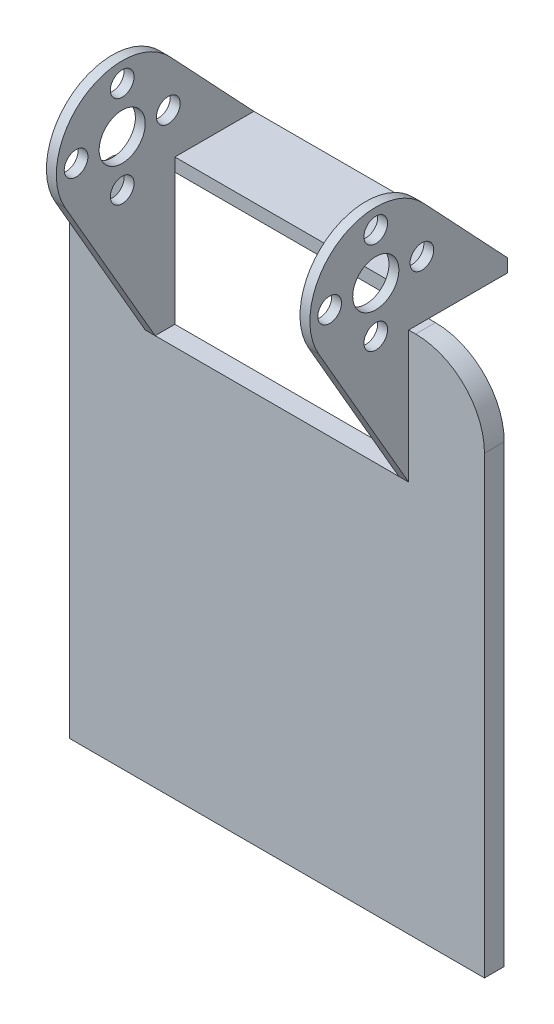
ISO-10303-21;
HEADER;
FILE_DESCRIPTION(('STEP AP214'),'2;1');
FILE_NAME('part.step','',(''),(''),'','','');
FILE_SCHEMA(('AUTOMOTIVE_DESIGN { 1 0 10303 214 1 1 1 1 }'));
ENDSEC;
DATA;
#1=APPLICATION_CONTEXT('core data for automotive mechanical design processes');
#2=APPLICATION_PROTOCOL_DEFINITION('international standard','automotive_design',2000,#1);
#3=PRODUCT_CONTEXT('',#1,'mechanical');
#4=PRODUCT('Part','Part','',(#3));
#5=PRODUCT_RELATED_PRODUCT_CATEGORY('part','',(#4));
#6=PRODUCT_DEFINITION_FORMATION('','',#4);
#7=PRODUCT_DEFINITION_CONTEXT('part definition',#1,'design');
#8=PRODUCT_DEFINITION('design','',#6,#7);
#9=PRODUCT_DEFINITION_SHAPE('','',#8);
#10=(LENGTH_UNIT() NAMED_UNIT(*) SI_UNIT(.MILLI.,.METRE.));
#11=(NAMED_UNIT(*) PLANE_ANGLE_UNIT() SI_UNIT($,.RADIAN.));
#12=(NAMED_UNIT(*) SI_UNIT($,.STERADIAN.) SOLID_ANGLE_UNIT());
#13=UNCERTAINTY_MEASURE_WITH_UNIT(LENGTH_MEASURE(1.E-05),#10,'distance_accuracy_value','');
#14=(GEOMETRIC_REPRESENTATION_CONTEXT(3) GLOBAL_UNCERTAINTY_ASSIGNED_CONTEXT((#13)) GLOBAL_UNIT_ASSIGNED_CONTEXT((#10,
#11,#12)) REPRESENTATION_CONTEXT('',''));
#15=CARTESIAN_POINT('',(0.,0.,0.));
#16=DIRECTION('',(0.,0.,1.));
#17=DIRECTION('',(1.,0.,0.));
#18=AXIS2_PLACEMENT_3D('',#15,#16,#17);
#19=CARTESIAN_POINT('',(51.5,88.1102540378444,8.));
#20=DIRECTION('',(-1.,0.,0.));
#21=DIRECTION('',(0.,-1.,0.));
#22=AXIS2_PLACEMENT_3D('',#19,#20,#21);
#23=CYLINDRICAL_SURFACE('',#22,10.);
#24=DIRECTION('',(-1.,0.,0.));
#25=VECTOR('',#24,1.);
#26=CARTESIAN_POINT('',(51.5,94.9636250995552,0.717740385669768));
#27=LINE('',#26,#25);
#28=CARTESIAN_POINT('',(51.5,94.9636250995552,0.717740385669768));
#29=VERTEX_POINT('',#28);
#30=CARTESIAN_POINT('',(50.,94.9636250995552,0.717740385669768));
#31=VERTEX_POINT('',#30);
#32=EDGE_CURVE('E193',#29,#31,#27,.T.);
#33=ORIENTED_EDGE('',*,*,#32,.T.);
#34=CARTESIAN_POINT('',(50.,88.1102540378444,8.));
#35=DIRECTION('',(-1.,0.,0.));
#36=DIRECTION('',(0.,-1.,0.));
#37=AXIS2_PLACEMENT_3D('',#34,#35,#36);
#38=CIRCLE('',#37,10.);
#39=CARTESIAN_POINT('',(50.,83.1102540378444,16.6602540378444));
#40=VERTEX_POINT('',#39);
#41=EDGE_CURVE('E62',#40,#31,#38,.T.);
#42=ORIENTED_EDGE('',*,*,#41,.F.);
#43=DIRECTION('',(-1.,0.,0.));
#44=VECTOR('',#43,1.);
#45=CARTESIAN_POINT('',(51.5,83.1102540378444,16.6602540378444));
#46=LINE('',#45,#44);
#47=CARTESIAN_POINT('',(51.5,83.1102540378444,16.6602540378444));
#48=VERTEX_POINT('',#47);
#49=EDGE_CURVE('E190',#48,#40,#46,.T.);
#50=ORIENTED_EDGE('',*,*,#49,.F.);
#51=CARTESIAN_POINT('',(51.5,88.1102540378444,8.));
#52=DIRECTION('',(-1.,0.,0.));
#53=DIRECTION('',(0.,-1.,0.));
#54=AXIS2_PLACEMENT_3D('',#51,#52,#53);
#55=CIRCLE('',#54,10.);
#56=EDGE_CURVE('E349',#48,#29,#55,.T.);
#57=ORIENTED_EDGE('',*,*,#56,.T.);
#58=EDGE_LOOP('',(#33,#42,#50,#57));
#59=FACE_BOUND('',#58,.T.);
#60=ADVANCED_FACE('F37',(#59),#23,.T.);
#61=CARTESIAN_POINT('',(51.5,13.5634618943234,-23.4926051274925));
#62=DIRECTION('',(0.,0.500000000000001,-0.866025403784438));
#63=DIRECTION('',(0.,0.866025403784438,0.500000000000001));
#64=AXIS2_PLACEMENT_3D('',#61,#62,#63);
#65=PLANE('',#64);
#66=DIRECTION('',(0.,0.866025403784438,0.500000000000001));
#67=VECTOR('',#66,1.);
#68=CARTESIAN_POINT('',(50.,13.5634618943234,-23.4926051274925));
#69=LINE('',#68,#67);
#70=CARTESIAN_POINT('',(50.,59.4500000000001,3.));
#71=VERTEX_POINT('',#70);
#72=EDGE_CURVE('E177',#71,#40,#69,.T.);
#73=ORIENTED_EDGE('',*,*,#72,.F.);
#74=DIRECTION('',(-1.,0.,0.));
#75=VECTOR('',#74,1.);
#76=CARTESIAN_POINT('',(51.5,59.4500000000001,3.));
#77=LINE('',#76,#75);
#78=CARTESIAN_POINT('',(51.5,59.4500000000001,3.));
#79=VERTEX_POINT('',#78);
#80=EDGE_CURVE('E205',#79,#71,#77,.T.);
#81=ORIENTED_EDGE('',*,*,#80,.F.);
#82=DIRECTION('',(0.,-0.866025403784438,-0.500000000000001));
#83=VECTOR('',#82,1.);
#84=CARTESIAN_POINT('',(51.5,13.5634618943234,-23.4926051274925));
#85=LINE('',#84,#83);
#86=EDGE_CURVE('E197',#48,#79,#85,.T.);
#87=ORIENTED_EDGE('',*,*,#86,.F.);
#88=ORIENTED_EDGE('',*,*,#49,.T.);
#89=EDGE_LOOP('',(#73,#81,#87,#88));
#90=FACE_BOUND('',#89,.T.);
#91=ADVANCED_FACE('F196',(#90),#65,.F.);
#92=CARTESIAN_POINT('',(51.5,44.2449652803494,-47.0138448505518));
#93=DIRECTION('',(0.,-0.685337106171078,0.728225961433024));
#94=DIRECTION('',(0.,-0.728225961433024,-0.685337106171078));
#95=AXIS2_PLACEMENT_3D('',#92,#93,#94);
#96=PLANE('',#95);
#97=DIRECTION('',(0.,-0.728225961433025,-0.685337106171078));
#98=VECTOR('',#97,1.);
#99=CARTESIAN_POINT('',(50.,44.2449652803494,-47.0138448505518));
#100=LINE('',#99,#98);
#101=CARTESIAN_POINT('',(50.,81.45,-12.));
#102=VERTEX_POINT('',#101);
#103=EDGE_CURVE('E194',#31,#102,#100,.T.);
#104=ORIENTED_EDGE('',*,*,#103,.F.);
#105=ORIENTED_EDGE('',*,*,#32,.F.);
#106=DIRECTION('',(0.,0.728225961433024,0.685337106171078));
#107=VECTOR('',#106,1.);
#108=CARTESIAN_POINT('',(51.5,44.2449652803494,-47.0138448505518));
#109=LINE('',#108,#107);
#110=CARTESIAN_POINT('',(51.5,81.45,-12.));
#111=VERTEX_POINT('',#110);
#112=EDGE_CURVE('E351',#111,#29,#109,.T.);
#113=ORIENTED_EDGE('',*,*,#112,.F.);
#114=DIRECTION('',(1.,0.,0.));
#115=VECTOR('',#114,1.);
#116=CARTESIAN_POINT('',(51.5,81.45,-12.));
#117=LINE('',#116,#115);
#118=EDGE_CURVE('E217',#102,#111,#117,.T.);
#119=ORIENTED_EDGE('',*,*,#118,.F.);
#120=EDGE_LOOP('',(#104,#105,#113,#119));
#121=FACE_BOUND('',#120,.T.);
#122=ADVANCED_FACE('F409',(#121),#96,.F.);
#123=CARTESIAN_POINT('',(10.45,69.,3.));
#124=DIRECTION('',(0.,0.,-1.));
#125=DIRECTION('',(-1.,0.,0.));
#126=AXIS2_PLACEMENT_3D('',#123,#124,#125);
#127=PLANE('',#126);
#128=DIRECTION('',(0.,-1.,0.));
#129=VECTOR('',#128,1.);
#130=CARTESIAN_POINT('',(51.5,0.,3.));
#131=LINE('',#130,#129);
#132=CARTESIAN_POINT('',(51.5,79.45,3.));
#133=VERTEX_POINT('',#132);
#134=EDGE_CURVE('E352',#133,#79,#131,.T.);
#135=ORIENTED_EDGE('',*,*,#134,.T.);
#136=ORIENTED_EDGE('',*,*,#80,.T.);
#137=DIRECTION('',(1.,0.,0.));
#138=VECTOR('',#137,1.);
#139=CARTESIAN_POINT('',(13.,59.4500000000001,3.));
#140=LINE('',#139,#138);
#141=CARTESIAN_POINT('',(13.,59.4500000000001,3.));
#142=VERTEX_POINT('',#141);
#143=EDGE_CURVE('E327',#142,#71,#140,.T.);
#144=ORIENTED_EDGE('',*,*,#143,.F.);
#145=CARTESIAN_POINT('',(11.5,59.4500000000001,3.));
#146=VERTEX_POINT('',#145);
#147=EDGE_CURVE('E210',#142,#146,#77,.T.);
#148=ORIENTED_EDGE('',*,*,#147,.T.);
#149=DIRECTION('',(0.,-1.,0.));
#150=VECTOR('',#149,1.);
#151=CARTESIAN_POINT('',(11.5,0.,3.));
#152=LINE('',#151,#150);
#153=CARTESIAN_POINT('',(11.5,79.45,3.));
#154=VERTEX_POINT('',#153);
#155=EDGE_CURVE('E343',#154,#146,#152,.T.);
#156=ORIENTED_EDGE('',*,*,#155,.F.);
#157=DIRECTION('',(-1.,0.,0.));
#158=VECTOR('',#157,1.);
#159=CARTESIAN_POINT('',(10.45,79.45,3.));
#160=LINE('',#159,#158);
#161=CARTESIAN_POINT('',(10.45,79.45,3.));
#162=VERTEX_POINT('',#161);
#163=EDGE_CURVE('E240',#154,#162,#160,.T.);
#164=ORIENTED_EDGE('',*,*,#163,.T.);
#165=CARTESIAN_POINT('',(10.45,69.,3.));
#166=DIRECTION('',(0.,0.,1.));
#167=DIRECTION('',(-1.,0.,0.));
#168=AXIS2_PLACEMENT_3D('',#165,#166,#167);
#169=CIRCLE('',#168,10.45);
#170=CARTESIAN_POINT('',(0.,69.,3.));
#171=VERTEX_POINT('',#170);
#172=EDGE_CURVE('E244',#162,#171,#169,.T.);
#173=ORIENTED_EDGE('',*,*,#172,.T.);
#174=DIRECTION('',(0.,-1.,0.));
#175=VECTOR('',#174,1.);
#176=CARTESIAN_POINT('',(0.,0.,3.));
#177=LINE('',#176,#175);
#178=CARTESIAN_POINT('',(0.,0.,3.));
#179=VERTEX_POINT('',#178);
#180=EDGE_CURVE('E230',#171,#179,#177,.T.);
#181=ORIENTED_EDGE('',*,*,#180,.T.);
#182=DIRECTION('',(1.,0.,0.));
#183=VECTOR('',#182,1.);
#184=CARTESIAN_POINT('',(0.,0.,3.));
#185=LINE('',#184,#183);
#186=CARTESIAN_POINT('',(63.,0.,3.));
#187=VERTEX_POINT('',#186);
#188=EDGE_CURVE('E233',#179,#187,#185,.T.);
#189=ORIENTED_EDGE('',*,*,#188,.T.);
#190=DIRECTION('',(0.,1.,0.));
#191=VECTOR('',#190,1.);
#192=CARTESIAN_POINT('',(63.,0.,3.));
#193=LINE('',#192,#191);
#194=CARTESIAN_POINT('',(63.,69.,3.));
#195=VERTEX_POINT('',#194);
#196=EDGE_CURVE('E236',#187,#195,#193,.T.);
#197=ORIENTED_EDGE('',*,*,#196,.T.);
#198=CARTESIAN_POINT('',(52.55,69.,3.));
#199=DIRECTION('',(0.,0.,1.));
#200=DIRECTION('',(1.,0.,0.));
#201=AXIS2_PLACEMENT_3D('',#198,#199,#200);
#202=CIRCLE('',#201,10.45);
#203=CARTESIAN_POINT('',(52.55,79.45,3.));
#204=VERTEX_POINT('',#203);
#205=EDGE_CURVE('E238',#195,#204,#202,.T.);
#206=ORIENTED_EDGE('',*,*,#205,.T.);
#207=EDGE_CURVE('E241',#204,#133,#160,.T.);
#208=ORIENTED_EDGE('',*,*,#207,.T.);
#209=EDGE_LOOP('',(#135,#136,#144,#148,#156,#164,#173,#181,#189,#197,#206,#208));
#210=FACE_BOUND('',#209,.T.);
#211=ADVANCED_FACE('F390',(#210),#127,.F.);
#212=CARTESIAN_POINT('',(10.45,79.45,3.));
#213=DIRECTION('',(0.,-1.,0.));
#214=DIRECTION('',(0.,0.,-1.));
#215=AXIS2_PLACEMENT_3D('',#212,#213,#214);
#216=PLANE('',#215);
#217=DIRECTION('',(0.,0.,1.));
#218=VECTOR('',#217,1.);
#219=CARTESIAN_POINT('',(51.5,79.45,-12.));
#220=LINE('',#219,#218);
#221=CARTESIAN_POINT('',(51.5,79.45,0.));
#222=VERTEX_POINT('',#221);
#223=EDGE_CURVE('E225',#222,#133,#220,.T.);
#224=ORIENTED_EDGE('',*,*,#223,.T.);
#225=ORIENTED_EDGE('',*,*,#207,.F.);
#226=DIRECTION('',(0.,0.,-1.));
#227=VECTOR('',#226,1.);
#228=CARTESIAN_POINT('',(52.55,79.45,3.));
#229=LINE('',#228,#227);
#230=CARTESIAN_POINT('',(52.55,79.45,0.));
#231=VERTEX_POINT('',#230);
#232=EDGE_CURVE('E267',#204,#231,#229,.T.);
#233=ORIENTED_EDGE('',*,*,#232,.T.);
#234=DIRECTION('',(-1.,0.,0.));
#235=VECTOR('',#234,1.);
#236=CARTESIAN_POINT('',(10.45,79.45,0.));
#237=LINE('',#236,#235);
#238=EDGE_CURVE('E256',#231,#222,#237,.T.);
#239=ORIENTED_EDGE('',*,*,#238,.T.);
#240=EDGE_LOOP('',(#224,#225,#233,#239));
#241=FACE_BOUND('',#240,.T.);
#242=ADVANCED_FACE('F418',(#241),#216,.F.);
#243=DIRECTION('',(0.,0.,1.));
#244=VECTOR('',#243,1.);
#245=CARTESIAN_POINT('',(11.5,79.45,-12.));
#246=LINE('',#245,#244);
#247=CARTESIAN_POINT('',(11.5,79.45,0.));
#248=VERTEX_POINT('',#247);
#249=EDGE_CURVE('E221',#248,#154,#246,.T.);
#250=ORIENTED_EDGE('',*,*,#249,.F.);
#251=CARTESIAN_POINT('',(10.45,79.45,0.));
#252=VERTEX_POINT('',#251);
#253=EDGE_CURVE('E255',#248,#252,#237,.T.);
#254=ORIENTED_EDGE('',*,*,#253,.T.);
#255=DIRECTION('',(0.,0.,-1.));
#256=VECTOR('',#255,1.);
#257=CARTESIAN_POINT('',(10.45,79.45,3.));
#258=LINE('',#257,#256);
#259=EDGE_CURVE('E264',#162,#252,#258,.T.);
#260=ORIENTED_EDGE('',*,*,#259,.F.);
#261=ORIENTED_EDGE('',*,*,#163,.F.);
#262=EDGE_LOOP('',(#250,#254,#260,#261));
#263=FACE_BOUND('',#262,.T.);
#264=ADVANCED_FACE('F388',(#263),#216,.F.);
#265=CARTESIAN_POINT('',(0.,0.,3.));
#266=DIRECTION('',(1.,0.,0.));
#267=DIRECTION('',(0.,0.,-1.));
#268=AXIS2_PLACEMENT_3D('',#265,#266,#267);
#269=PLANE('',#268);
#270=DIRECTION('',(0.,-1.,0.));
#271=VECTOR('',#270,1.);
#272=CARTESIAN_POINT('',(0.,0.,0.));
#273=LINE('',#272,#271);
#274=CARTESIAN_POINT('',(0.,69.,0.));
#275=VERTEX_POINT('',#274);
#276=CARTESIAN_POINT('',(0.,0.,0.));
#277=VERTEX_POINT('',#276);
#278=EDGE_CURVE('E229',#275,#277,#273,.T.);
#279=ORIENTED_EDGE('',*,*,#278,.T.);
#280=DIRECTION('',(0.,0.,-1.));
#281=VECTOR('',#280,1.);
#282=CARTESIAN_POINT('',(0.,0.,3.));
#283=LINE('',#282,#281);
#284=EDGE_CURVE('E11',#179,#277,#283,.T.);
#285=ORIENTED_EDGE('',*,*,#284,.F.);
#286=ORIENTED_EDGE('',*,*,#180,.F.);
#287=DIRECTION('',(0.,0.,-1.));
#288=VECTOR('',#287,1.);
#289=CARTESIAN_POINT('',(0.,69.,3.));
#290=LINE('',#289,#288);
#291=EDGE_CURVE('E246',#171,#275,#290,.T.);
#292=ORIENTED_EDGE('',*,*,#291,.T.);
#293=EDGE_LOOP('',(#279,#285,#286,#292));
#294=FACE_BOUND('',#293,.T.);
#295=ADVANCED_FACE('F39',(#294),#269,.F.);
#296=CARTESIAN_POINT('',(0.,0.,3.));
#297=DIRECTION('',(0.,1.,0.));
#298=DIRECTION('',(0.,0.,1.));
#299=AXIS2_PLACEMENT_3D('',#296,#297,#298);
#300=PLANE('',#299);
#301=DIRECTION('',(1.,0.,0.));
#302=VECTOR('',#301,1.);
#303=CARTESIAN_POINT('',(0.,0.,0.));
#304=LINE('',#303,#302);
#305=CARTESIAN_POINT('',(63.,0.,0.));
#306=VERTEX_POINT('',#305);
#307=EDGE_CURVE('E249',#277,#306,#304,.T.);
#308=ORIENTED_EDGE('',*,*,#307,.T.);
#309=DIRECTION('',(0.,0.,-1.));
#310=VECTOR('',#309,1.);
#311=CARTESIAN_POINT('',(63.,0.,3.));
#312=LINE('',#311,#310);
#313=EDGE_CURVE('E46',#187,#306,#312,.T.);
#314=ORIENTED_EDGE('',*,*,#313,.F.);
#315=ORIENTED_EDGE('',*,*,#188,.F.);
#316=ORIENTED_EDGE('',*,*,#284,.T.);
#317=EDGE_LOOP('',(#308,#314,#315,#316));
#318=FACE_BOUND('',#317,.T.);
#319=ADVANCED_FACE('F431',(#318),#300,.F.);
#320=CARTESIAN_POINT('',(63.,0.,3.));
#321=DIRECTION('',(-1.,0.,0.));
#322=DIRECTION('',(0.,-1.,0.));
#323=AXIS2_PLACEMENT_3D('',#320,#321,#322);
#324=PLANE('',#323);
#325=DIRECTION('',(0.,1.,0.));
#326=VECTOR('',#325,1.);
#327=CARTESIAN_POINT('',(63.,0.,0.));
#328=LINE('',#327,#326);
#329=CARTESIAN_POINT('',(63.,69.,0.));
#330=VERTEX_POINT('',#329);
#331=EDGE_CURVE('E251',#306,#330,#328,.T.);
#332=ORIENTED_EDGE('',*,*,#331,.T.);
#333=DIRECTION('',(0.,0.,-1.));
#334=VECTOR('',#333,1.);
#335=CARTESIAN_POINT('',(63.,69.,3.));
#336=LINE('',#335,#334);
#337=EDGE_CURVE('E270',#195,#330,#336,.T.);
#338=ORIENTED_EDGE('',*,*,#337,.F.);
#339=ORIENTED_EDGE('',*,*,#196,.F.);
#340=ORIENTED_EDGE('',*,*,#313,.T.);
#341=EDGE_LOOP('',(#332,#338,#339,#340));
#342=FACE_BOUND('',#341,.T.);
#343=ADVANCED_FACE('F427',(#342),#324,.F.);
#344=CARTESIAN_POINT('',(52.55,69.,3.));
#345=DIRECTION('',(0.,0.,-1.));
#346=DIRECTION('',(-1.,0.,0.));
#347=AXIS2_PLACEMENT_3D('',#344,#345,#346);
#348=CYLINDRICAL_SURFACE('',#347,10.45);
#349=CARTESIAN_POINT('',(52.55,69.,0.));
#350=DIRECTION('',(0.,0.,1.));
#351=DIRECTION('',(1.,0.,0.));
#352=AXIS2_PLACEMENT_3D('',#349,#350,#351);
#353=CIRCLE('',#352,10.45);
#354=EDGE_CURVE('E253',#330,#231,#353,.T.);
#355=ORIENTED_EDGE('',*,*,#354,.T.);
#356=ORIENTED_EDGE('',*,*,#232,.F.);
#357=ORIENTED_EDGE('',*,*,#205,.F.);
#358=ORIENTED_EDGE('',*,*,#337,.T.);
#359=EDGE_LOOP('',(#355,#356,#357,#358));
#360=FACE_BOUND('',#359,.T.);
#361=ADVANCED_FACE('F423',(#360),#348,.T.);
#362=CARTESIAN_POINT('',(10.45,69.,3.));
#363=DIRECTION('',(0.,0.,-1.));
#364=DIRECTION('',(-1.,0.,0.));
#365=AXIS2_PLACEMENT_3D('',#362,#363,#364);
#366=CYLINDRICAL_SURFACE('',#365,10.45);
#367=CARTESIAN_POINT('',(10.45,69.,0.));
#368=DIRECTION('',(0.,0.,1.));
#369=DIRECTION('',(-1.,0.,0.));
#370=AXIS2_PLACEMENT_3D('',#367,#368,#369);
#371=CIRCLE('',#370,10.45);
#372=EDGE_CURVE('E234',#252,#275,#371,.T.);
#373=ORIENTED_EDGE('',*,*,#372,.T.);
#374=ORIENTED_EDGE('',*,*,#291,.F.);
#375=ORIENTED_EDGE('',*,*,#172,.F.);
#376=ORIENTED_EDGE('',*,*,#259,.T.);
#377=EDGE_LOOP('',(#373,#374,#375,#376));
#378=FACE_BOUND('',#377,.T.);
#379=ADVANCED_FACE('F436',(#378),#366,.T.);
#380=CARTESIAN_POINT('',(10.45,69.,0.));
#381=DIRECTION('',(0.,0.,-1.));
#382=DIRECTION('',(-1.,0.,0.));
#383=AXIS2_PLACEMENT_3D('',#380,#381,#382);
#384=PLANE('',#383);
#385=DIRECTION('',(0.,-1.,0.));
#386=VECTOR('',#385,1.);
#387=CARTESIAN_POINT('',(13.,0.,0.));
#388=LINE('',#387,#386);
#389=CARTESIAN_POINT('',(13.,79.45,0.));
#390=VERTEX_POINT('',#389);
#391=CARTESIAN_POINT('',(13.,59.4500000000001,0.));
#392=VERTEX_POINT('',#391);
#393=EDGE_CURVE('E323',#390,#392,#388,.T.);
#394=ORIENTED_EDGE('',*,*,#393,.T.);
#395=DIRECTION('',(1.,0.,0.));
#396=VECTOR('',#395,1.);
#397=CARTESIAN_POINT('',(13.,59.4500000000001,0.));
#398=LINE('',#397,#396);
#399=CARTESIAN_POINT('',(50.,59.4500000000001,0.));
#400=VERTEX_POINT('',#399);
#401=EDGE_CURVE('E329',#392,#400,#398,.T.);
#402=ORIENTED_EDGE('',*,*,#401,.T.);
#403=DIRECTION('',(0.,-1.,0.));
#404=VECTOR('',#403,1.);
#405=CARTESIAN_POINT('',(50.,0.,0.));
#406=LINE('',#405,#404);
#407=CARTESIAN_POINT('',(50.,79.45,0.));
#408=VERTEX_POINT('',#407);
#409=EDGE_CURVE('E307',#408,#400,#406,.T.);
#410=ORIENTED_EDGE('',*,*,#409,.F.);
#411=EDGE_CURVE('E259',#222,#408,#237,.T.);
#412=ORIENTED_EDGE('',*,*,#411,.F.);
#413=ORIENTED_EDGE('',*,*,#238,.F.);
#414=ORIENTED_EDGE('',*,*,#354,.F.);
#415=ORIENTED_EDGE('',*,*,#331,.F.);
#416=ORIENTED_EDGE('',*,*,#307,.F.);
#417=ORIENTED_EDGE('',*,*,#278,.F.);
#418=ORIENTED_EDGE('',*,*,#372,.F.);
#419=ORIENTED_EDGE('',*,*,#253,.F.);
#420=EDGE_CURVE('E260',#390,#248,#237,.T.);
#421=ORIENTED_EDGE('',*,*,#420,.F.);
#422=EDGE_LOOP('',(#394,#402,#410,#412,#413,#414,#415,#416,#417,#418,#419,#421));
#423=FACE_BOUND('',#422,.T.);
#424=ADVANCED_FACE('F383',(#423),#384,.T.);
#425=CARTESIAN_POINT('',(51.5,79.45,-12.));
#426=DIRECTION('',(-1.,0.,0.));
#427=DIRECTION('',(0.,0.,1.));
#428=AXIS2_PLACEMENT_3D('',#425,#426,#427);
#429=PLANE('',#428);
#430=CARTESIAN_POINT('',(51.5,95.1102540378443,8.));
#431=DIRECTION('',(-1.,0.,0.));
#432=DIRECTION('',(0.,0.,1.));
#433=AXIS2_PLACEMENT_3D('',#430,#431,#432);
#434=CIRCLE('',#433,1.8);
#435=CARTESIAN_POINT('',(51.5,95.1102540378443,9.8));
#436=VERTEX_POINT('',#435);
#437=EDGE_CURVE('E279',#436,#436,#434,.F.);
#438=ORIENTED_EDGE('',*,*,#437,.F.);
#439=EDGE_LOOP('',(#438));
#440=FACE_BOUND('',#439,.T.);
#441=CARTESIAN_POINT('',(51.5,88.1102540378443,8.));
#442=DIRECTION('',(-1.,0.,0.));
#443=DIRECTION('',(0.,0.,1.));
#444=AXIS2_PLACEMENT_3D('',#441,#442,#443);
#445=CIRCLE('',#444,3.5);
#446=CARTESIAN_POINT('',(51.5,88.1102540378443,11.5));
#447=VERTEX_POINT('',#446);
#448=EDGE_CURVE('E560',#447,#447,#445,.F.);
#449=ORIENTED_EDGE('',*,*,#448,.F.);
#450=EDGE_LOOP('',(#449));
#451=FACE_BOUND('',#450,.T.);
#452=CARTESIAN_POINT('',(51.5,88.1102540378441,1.0000000000002));
#453=DIRECTION('',(-1.,0.,0.));
#454=DIRECTION('',(0.,0.,1.));
#455=AXIS2_PLACEMENT_3D('',#452,#453,#454);
#456=CIRCLE('',#455,1.8);
#457=CARTESIAN_POINT('',(51.5,88.1102540378441,2.8000000000002));
#458=VERTEX_POINT('',#457);
#459=EDGE_CURVE('E554',#458,#458,#456,.F.);
#460=ORIENTED_EDGE('',*,*,#459,.F.);
#461=EDGE_LOOP('',(#460));
#462=FACE_BOUND('',#461,.T.);
#463=CARTESIAN_POINT('',(51.5,81.1102540378442,8.00000000000035));
#464=DIRECTION('',(-1.,0.,0.));
#465=DIRECTION('',(0.,0.,1.));
#466=AXIS2_PLACEMENT_3D('',#463,#464,#465);
#467=CIRCLE('',#466,1.8);
#468=CARTESIAN_POINT('',(51.5,81.1102540378442,9.80000000000035));
#469=VERTEX_POINT('',#468);
#470=EDGE_CURVE('E547',#469,#469,#467,.F.);
#471=ORIENTED_EDGE('',*,*,#470,.F.);
#472=EDGE_LOOP('',(#471));
#473=FACE_BOUND('',#472,.T.);
#474=CARTESIAN_POINT('',(51.5,88.1102540378444,15.0000000000002));
#475=DIRECTION('',(-1.,0.,0.));
#476=DIRECTION('',(0.,0.,1.));
#477=AXIS2_PLACEMENT_3D('',#474,#475,#476);
#478=CIRCLE('',#477,1.79999999999999);
#479=CARTESIAN_POINT('',(51.5,88.1102540378444,16.8000000000002));
#480=VERTEX_POINT('',#479);
#481=EDGE_CURVE('E555',#480,#480,#478,.F.);
#482=ORIENTED_EDGE('',*,*,#481,.F.);
#483=EDGE_LOOP('',(#482));
#484=FACE_BOUND('',#483,.T.);
#485=ORIENTED_EDGE('',*,*,#134,.F.);
#486=ORIENTED_EDGE('',*,*,#223,.F.);
#487=CARTESIAN_POINT('',(51.5,79.45,-12.));
#488=VERTEX_POINT('',#487);
#489=EDGE_CURVE('E226',#488,#222,#220,.T.);
#490=ORIENTED_EDGE('',*,*,#489,.F.);
#491=DIRECTION('',(0.,-1.,0.));
#492=VECTOR('',#491,1.);
#493=CARTESIAN_POINT('',(51.5,79.45,-12.));
#494=LINE('',#493,#492);
#495=EDGE_CURVE('E199',#111,#488,#494,.T.);
#496=ORIENTED_EDGE('',*,*,#495,.F.);
#497=ORIENTED_EDGE('',*,*,#112,.T.);
#498=ORIENTED_EDGE('',*,*,#56,.F.);
#499=ORIENTED_EDGE('',*,*,#86,.T.);
#500=EDGE_LOOP('',(#485,#486,#490,#496,#497,#498,#499));
#501=FACE_BOUND('',#500,.T.);
#502=ADVANCED_FACE('F413',(#440,#451,#462,#473,#484,#501),#429,.F.);
#503=CARTESIAN_POINT('',(51.5,79.45,-12.));
#504=DIRECTION('',(0.,1.,0.));
#505=DIRECTION('',(0.,0.,1.));
#506=AXIS2_PLACEMENT_3D('',#503,#504,#505);
#507=PLANE('',#506);
#508=ORIENTED_EDGE('',*,*,#411,.T.);
#509=EDGE_CURVE('E379',#408,#390,#237,.T.);
#510=ORIENTED_EDGE('',*,*,#509,.T.);
#511=ORIENTED_EDGE('',*,*,#420,.T.);
#512=CARTESIAN_POINT('',(11.5,79.45,-12.));
#513=VERTEX_POINT('',#512);
#514=EDGE_CURVE('E222',#513,#248,#246,.T.);
#515=ORIENTED_EDGE('',*,*,#514,.F.);
#516=DIRECTION('',(-1.,0.,0.));
#517=VECTOR('',#516,1.);
#518=CARTESIAN_POINT('',(51.5,79.45,-12.));
#519=LINE('',#518,#517);
#520=EDGE_CURVE('E203',#488,#513,#519,.T.);
#521=ORIENTED_EDGE('',*,*,#520,.F.);
#522=ORIENTED_EDGE('',*,*,#489,.T.);
#523=EDGE_LOOP('',(#508,#510,#511,#515,#521,#522));
#524=FACE_BOUND('',#523,.T.);
#525=ADVANCED_FACE('F375',(#524),#507,.F.);
#526=CARTESIAN_POINT('',(11.5,79.45,-12.));
#527=DIRECTION('',(1.,0.,0.));
#528=DIRECTION('',(0.,1.,0.));
#529=AXIS2_PLACEMENT_3D('',#526,#527,#528);
#530=PLANE('',#529);
#531=CARTESIAN_POINT('',(11.5000000000001,95.1102540378444,8.));
#532=DIRECTION('',(-1.,0.,0.));
#533=DIRECTION('',(0.,-1.,0.));
#534=AXIS2_PLACEMENT_3D('',#531,#532,#533);
#535=CIRCLE('',#534,1.8);
#536=CARTESIAN_POINT('',(11.5,93.3102540378444,8.));
#537=VERTEX_POINT('',#536);
#538=EDGE_CURVE('E535',#537,#537,#535,.T.);
#539=ORIENTED_EDGE('',*,*,#538,.F.);
#540=EDGE_LOOP('',(#539));
#541=FACE_BOUND('',#540,.T.);
#542=CARTESIAN_POINT('',(11.5,88.1102540378444,8.));
#543=DIRECTION('',(-1.,0.,0.));
#544=DIRECTION('',(0.,-1.,0.));
#545=AXIS2_PLACEMENT_3D('',#542,#543,#544);
#546=CIRCLE('',#545,3.5);
#547=CARTESIAN_POINT('',(11.5,84.6102540378444,8.));
#548=VERTEX_POINT('',#547);
#549=EDGE_CURVE('E564',#548,#548,#546,.T.);
#550=ORIENTED_EDGE('',*,*,#549,.F.);
#551=EDGE_LOOP('',(#550));
#552=FACE_BOUND('',#551,.T.);
#553=CARTESIAN_POINT('',(11.5,88.1102540378443,1.0000000000002));
#554=DIRECTION('',(-1.,0.,0.));
#555=DIRECTION('',(0.,-1.,0.));
#556=AXIS2_PLACEMENT_3D('',#553,#554,#555);
#557=CIRCLE('',#556,1.8);
#558=CARTESIAN_POINT('',(11.5,86.3102540378443,1.0000000000002));
#559=VERTEX_POINT('',#558);
#560=EDGE_CURVE('E563',#559,#559,#557,.T.);
#561=ORIENTED_EDGE('',*,*,#560,.F.);
#562=EDGE_LOOP('',(#561));
#563=FACE_BOUND('',#562,.T.);
#564=CARTESIAN_POINT('',(11.5,81.1102540378444,8.00000000000035));
#565=DIRECTION('',(-1.,0.,0.));
#566=DIRECTION('',(0.,-1.,0.));
#567=AXIS2_PLACEMENT_3D('',#564,#565,#566);
#568=CIRCLE('',#567,1.8);
#569=CARTESIAN_POINT('',(11.5,79.3102540378444,8.00000000000035));
#570=VERTEX_POINT('',#569);
#571=EDGE_CURVE('E551',#570,#570,#568,.T.);
#572=ORIENTED_EDGE('',*,*,#571,.F.);
#573=EDGE_LOOP('',(#572));
#574=FACE_BOUND('',#573,.T.);
#575=CARTESIAN_POINT('',(11.5,88.1102540378445,15.0000000000002));
#576=DIRECTION('',(-1.,0.,0.));
#577=DIRECTION('',(0.,-1.,0.));
#578=AXIS2_PLACEMENT_3D('',#575,#576,#577);
#579=CIRCLE('',#578,1.79999999999999);
#580=CARTESIAN_POINT('',(11.5,86.3102540378445,15.0000000000002));
#581=VERTEX_POINT('',#580);
#582=EDGE_CURVE('E550',#581,#581,#579,.T.);
#583=ORIENTED_EDGE('',*,*,#582,.F.);
#584=EDGE_LOOP('',(#583));
#585=FACE_BOUND('',#584,.T.);
#586=ORIENTED_EDGE('',*,*,#249,.T.);
#587=ORIENTED_EDGE('',*,*,#155,.T.);
#588=DIRECTION('',(0.,-0.866025403784438,-0.500000000000001));
#589=VECTOR('',#588,1.);
#590=CARTESIAN_POINT('',(11.5,13.5634618943234,-23.4926051274925));
#591=LINE('',#590,#589);
#592=CARTESIAN_POINT('',(11.5,83.1102540378444,16.6602540378444));
#593=VERTEX_POINT('',#592);
#594=EDGE_CURVE('E346',#593,#146,#591,.T.);
#595=ORIENTED_EDGE('',*,*,#594,.F.);
#596=CARTESIAN_POINT('',(11.5,88.1102540378444,8.));
#597=DIRECTION('',(-1.,0.,0.));
#598=DIRECTION('',(0.,-1.,0.));
#599=AXIS2_PLACEMENT_3D('',#596,#597,#598);
#600=CIRCLE('',#599,10.);
#601=CARTESIAN_POINT('',(11.5,94.9636250995552,0.717740385669768));
#602=VERTEX_POINT('',#601);
#603=EDGE_CURVE('E337',#593,#602,#600,.T.);
#604=ORIENTED_EDGE('',*,*,#603,.T.);
#605=DIRECTION('',(0.,0.728225961433024,0.685337106171078));
#606=VECTOR('',#605,1.);
#607=CARTESIAN_POINT('',(11.5,44.2449652803494,-47.0138448505518));
#608=LINE('',#607,#606);
#609=CARTESIAN_POINT('',(11.5,81.45,-12.));
#610=VERTEX_POINT('',#609);
#611=EDGE_CURVE('E340',#610,#602,#608,.T.);
#612=ORIENTED_EDGE('',*,*,#611,.F.);
#613=DIRECTION('',(0.,1.,0.));
#614=VECTOR('',#613,1.);
#615=CARTESIAN_POINT('',(11.5,79.45,-12.));
#616=LINE('',#615,#614);
#617=EDGE_CURVE('E214',#513,#610,#616,.T.);
#618=ORIENTED_EDGE('',*,*,#617,.F.);
#619=ORIENTED_EDGE('',*,*,#514,.T.);
#620=EDGE_LOOP('',(#586,#587,#595,#604,#612,#618,#619));
#621=FACE_BOUND('',#620,.T.);
#622=ADVANCED_FACE('F366',(#541,#552,#563,#574,#585,#621),#530,.F.);
#623=CARTESIAN_POINT('',(0.,0.,-12.));
#624=DIRECTION('',(0.,0.,1.));
#625=DIRECTION('',(1.,0.,0.));
#626=AXIS2_PLACEMENT_3D('',#623,#624,#625);
#627=PLANE('',#626);
#628=ORIENTED_EDGE('',*,*,#495,.T.);
#629=ORIENTED_EDGE('',*,*,#520,.T.);
#630=ORIENTED_EDGE('',*,*,#617,.T.);
#631=CARTESIAN_POINT('',(13.,81.45,-12.));
#632=VERTEX_POINT('',#631);
#633=EDGE_CURVE('E218',#610,#632,#117,.T.);
#634=ORIENTED_EDGE('',*,*,#633,.T.);
#635=DIRECTION('',(1.,0.,0.));
#636=VECTOR('',#635,1.);
#637=CARTESIAN_POINT('',(13.,81.45,-12.));
#638=LINE('',#637,#636);
#639=EDGE_CURVE('E334',#632,#102,#638,.T.);
#640=ORIENTED_EDGE('',*,*,#639,.T.);
#641=ORIENTED_EDGE('',*,*,#118,.T.);
#642=EDGE_LOOP('',(#628,#629,#630,#634,#640,#641));
#643=FACE_BOUND('',#642,.T.);
#644=ADVANCED_FACE('F370',(#643),#627,.F.);
#645=CARTESIAN_POINT('',(13.,88.1102540378444,8.));
#646=DIRECTION('',(-1.,0.,0.));
#647=DIRECTION('',(0.,-1.,0.));
#648=AXIS2_PLACEMENT_3D('',#645,#646,#647);
#649=CIRCLE('',#648,10.);
#650=CARTESIAN_POINT('',(13.,83.1102540378444,16.6602540378444));
#651=VERTEX_POINT('',#650);
#652=CARTESIAN_POINT('',(13.,94.9636250995552,0.717740385669775));
#653=VERTEX_POINT('',#652);
#654=EDGE_CURVE('E315',#651,#653,#649,.T.);
#655=ORIENTED_EDGE('',*,*,#654,.T.);
#656=EDGE_CURVE('E211',#653,#602,#27,.T.);
#657=ORIENTED_EDGE('',*,*,#656,.T.);
#658=ORIENTED_EDGE('',*,*,#603,.F.);
#659=EDGE_CURVE('E200',#651,#593,#46,.T.);
#660=ORIENTED_EDGE('',*,*,#659,.F.);
#661=EDGE_LOOP('',(#655,#657,#658,#660));
#662=FACE_BOUND('',#661,.T.);
#663=ADVANCED_FACE('F359',(#662),#23,.T.);
#664=ORIENTED_EDGE('',*,*,#147,.F.);
#665=DIRECTION('',(0.,0.866025403784438,0.500000000000001));
#666=VECTOR('',#665,1.);
#667=CARTESIAN_POINT('',(13.,13.5634618943234,-23.4926051274925));
#668=LINE('',#667,#666);
#669=EDGE_CURVE('E312',#142,#651,#668,.T.);
#670=ORIENTED_EDGE('',*,*,#669,.T.);
#671=ORIENTED_EDGE('',*,*,#659,.T.);
#672=ORIENTED_EDGE('',*,*,#594,.T.);
#673=EDGE_LOOP('',(#664,#670,#671,#672));
#674=FACE_BOUND('',#673,.T.);
#675=ADVANCED_FACE('F395',(#674),#65,.F.);
#676=ORIENTED_EDGE('',*,*,#656,.F.);
#677=DIRECTION('',(0.,-0.728225961433025,-0.685337106171078));
#678=VECTOR('',#677,1.);
#679=CARTESIAN_POINT('',(13.,44.2449652803494,-47.0138448505518));
#680=LINE('',#679,#678);
#681=EDGE_CURVE('E318',#653,#632,#680,.T.);
#682=ORIENTED_EDGE('',*,*,#681,.T.);
#683=ORIENTED_EDGE('',*,*,#633,.F.);
#684=ORIENTED_EDGE('',*,*,#611,.T.);
#685=EDGE_LOOP('',(#676,#682,#683,#684));
#686=FACE_BOUND('',#685,.T.);
#687=ADVANCED_FACE('F368',(#686),#96,.F.);
#688=CARTESIAN_POINT('',(13.,0.,0.));
#689=DIRECTION('',(0.,0.,1.));
#690=DIRECTION('',(1.,0.,0.));
#691=AXIS2_PLACEMENT_3D('',#688,#689,#690);
#692=PLANE('',#691);
#693=ORIENTED_EDGE('',*,*,#509,.F.);
#694=CARTESIAN_POINT('',(50.,81.45,0.));
#695=VERTEX_POINT('',#694);
#696=EDGE_CURVE('E308',#695,#408,#406,.T.);
#697=ORIENTED_EDGE('',*,*,#696,.F.);
#698=DIRECTION('',(1.,0.,0.));
#699=VECTOR('',#698,1.);
#700=CARTESIAN_POINT('',(13.,81.45,0.));
#701=LINE('',#700,#699);
#702=CARTESIAN_POINT('',(13.,81.45,0.));
#703=VERTEX_POINT('',#702);
#704=EDGE_CURVE('E332',#703,#695,#701,.T.);
#705=ORIENTED_EDGE('',*,*,#704,.F.);
#706=EDGE_CURVE('E54',#703,#390,#388,.T.);
#707=ORIENTED_EDGE('',*,*,#706,.T.);
#708=EDGE_LOOP('',(#693,#697,#705,#707));
#709=FACE_BOUND('',#708,.T.);
#710=ADVANCED_FACE('F404',(#709),#692,.T.);
#711=CARTESIAN_POINT('',(13.,81.45,0.));
#712=DIRECTION('',(0.,1.,0.));
#713=DIRECTION('',(-1.,0.,0.));
#714=AXIS2_PLACEMENT_3D('',#711,#712,#713);
#715=PLANE('',#714);
#716=ORIENTED_EDGE('',*,*,#639,.F.);
#717=DIRECTION('',(0.,0.,1.));
#718=VECTOR('',#717,1.);
#719=CARTESIAN_POINT('',(13.,81.45,0.));
#720=LINE('',#719,#718);
#721=EDGE_CURVE('E321',#632,#703,#720,.T.);
#722=ORIENTED_EDGE('',*,*,#721,.T.);
#723=ORIENTED_EDGE('',*,*,#704,.T.);
#724=DIRECTION('',(0.,0.,1.));
#725=VECTOR('',#724,1.);
#726=CARTESIAN_POINT('',(50.,81.45,0.));
#727=LINE('',#726,#725);
#728=EDGE_CURVE('E304',#102,#695,#727,.T.);
#729=ORIENTED_EDGE('',*,*,#728,.F.);
#730=EDGE_LOOP('',(#716,#722,#723,#729));
#731=FACE_BOUND('',#730,.T.);
#732=ADVANCED_FACE('F402',(#731),#715,.T.);
#733=CARTESIAN_POINT('',(13.,59.4500000000001,0.));
#734=DIRECTION('',(0.,1.,0.));
#735=DIRECTION('',(-1.,0.,0.));
#736=AXIS2_PLACEMENT_3D('',#733,#734,#735);
#737=PLANE('',#736);
#738=ORIENTED_EDGE('',*,*,#401,.F.);
#739=DIRECTION('',(0.,0.,1.));
#740=VECTOR('',#739,1.);
#741=CARTESIAN_POINT('',(13.,59.4500000000001,0.));
#742=LINE('',#741,#740);
#743=EDGE_CURVE('E325',#392,#142,#742,.T.);
#744=ORIENTED_EDGE('',*,*,#743,.T.);
#745=ORIENTED_EDGE('',*,*,#143,.T.);
#746=DIRECTION('',(0.,0.,1.));
#747=VECTOR('',#746,1.);
#748=CARTESIAN_POINT('',(50.,59.4500000000001,0.));
#749=LINE('',#748,#747);
#750=EDGE_CURVE('E180',#400,#71,#749,.T.);
#751=ORIENTED_EDGE('',*,*,#750,.F.);
#752=EDGE_LOOP('',(#738,#744,#745,#751));
#753=FACE_BOUND('',#752,.T.);
#754=ADVANCED_FACE('F485',(#753),#737,.T.);
#755=CARTESIAN_POINT('',(13.,0.,0.));
#756=DIRECTION('',(-1.,0.,0.));
#757=DIRECTION('',(0.,-1.,0.));
#758=AXIS2_PLACEMENT_3D('',#755,#756,#757);
#759=PLANE('',#758);
#760=CARTESIAN_POINT('',(13.,95.1102540378444,8.));
#761=DIRECTION('',(-1.,0.,0.));
#762=DIRECTION('',(0.,-1.,0.));
#763=AXIS2_PLACEMENT_3D('',#760,#761,#762);
#764=CIRCLE('',#763,1.8);
#765=CARTESIAN_POINT('',(13.,93.3102540378444,8.));
#766=VERTEX_POINT('',#765);
#767=EDGE_CURVE('E185',#766,#766,#764,.T.);
#768=ORIENTED_EDGE('',*,*,#767,.T.);
#769=EDGE_LOOP('',(#768));
#770=FACE_BOUND('',#769,.T.);
#771=CARTESIAN_POINT('',(13.,88.1102540378444,8.));
#772=DIRECTION('',(-1.,0.,0.));
#773=DIRECTION('',(0.,-1.,0.));
#774=AXIS2_PLACEMENT_3D('',#771,#772,#773);
#775=CIRCLE('',#774,3.5);
#776=CARTESIAN_POINT('',(13.,84.6102540378444,8.));
#777=VERTEX_POINT('',#776);
#778=EDGE_CURVE('E289',#777,#777,#775,.T.);
#779=ORIENTED_EDGE('',*,*,#778,.T.);
#780=EDGE_LOOP('',(#779));
#781=FACE_BOUND('',#780,.T.);
#782=CARTESIAN_POINT('',(13.,88.1102540378443,1.0000000000002));
#783=DIRECTION('',(-1.,0.,0.));
#784=DIRECTION('',(0.,-1.,0.));
#785=AXIS2_PLACEMENT_3D('',#782,#783,#784);
#786=CIRCLE('',#785,1.8);
#787=CARTESIAN_POINT('',(13.,86.3102540378443,1.0000000000002));
#788=VERTEX_POINT('',#787);
#789=EDGE_CURVE('E286',#788,#788,#786,.T.);
#790=ORIENTED_EDGE('',*,*,#789,.T.);
#791=EDGE_LOOP('',(#790));
#792=FACE_BOUND('',#791,.T.);
#793=CARTESIAN_POINT('',(13.,81.1102540378444,8.00000000000035));
#794=DIRECTION('',(-1.,0.,0.));
#795=DIRECTION('',(0.,-1.,0.));
#796=AXIS2_PLACEMENT_3D('',#793,#794,#795);
#797=CIRCLE('',#796,1.8);
#798=CARTESIAN_POINT('',(13.,79.3102540378444,8.00000000000035));
#799=VERTEX_POINT('',#798);
#800=EDGE_CURVE('E283',#799,#799,#797,.T.);
#801=ORIENTED_EDGE('',*,*,#800,.T.);
#802=EDGE_LOOP('',(#801));
#803=FACE_BOUND('',#802,.T.);
#804=CARTESIAN_POINT('',(13.,88.1102540378445,15.0000000000002));
#805=DIRECTION('',(-1.,0.,0.));
#806=DIRECTION('',(0.,-1.,0.));
#807=AXIS2_PLACEMENT_3D('',#804,#805,#806);
#808=CIRCLE('',#807,1.79999999999999);
#809=CARTESIAN_POINT('',(13.,86.3102540378445,15.0000000000002));
#810=VERTEX_POINT('',#809);
#811=EDGE_CURVE('E278',#810,#810,#808,.T.);
#812=ORIENTED_EDGE('',*,*,#811,.T.);
#813=EDGE_LOOP('',(#812));
#814=FACE_BOUND('',#813,.T.);
#815=ORIENTED_EDGE('',*,*,#669,.F.);
#816=ORIENTED_EDGE('',*,*,#743,.F.);
#817=ORIENTED_EDGE('',*,*,#393,.F.);
#818=ORIENTED_EDGE('',*,*,#706,.F.);
#819=ORIENTED_EDGE('',*,*,#721,.F.);
#820=ORIENTED_EDGE('',*,*,#681,.F.);
#821=ORIENTED_EDGE('',*,*,#654,.F.);
#822=EDGE_LOOP('',(#815,#816,#817,#818,#819,#820,#821));
#823=FACE_BOUND('',#822,.T.);
#824=ADVANCED_FACE('F399',(#770,#781,#792,#803,#814,#823),#759,.F.);
#825=CARTESIAN_POINT('',(50.,0.,0.));
#826=DIRECTION('',(-1.,0.,0.));
#827=DIRECTION('',(0.,-1.,0.));
#828=AXIS2_PLACEMENT_3D('',#825,#826,#827);
#829=PLANE('',#828);
#830=CARTESIAN_POINT('',(50.,95.1102540378443,8.));
#831=DIRECTION('',(-1.,0.,0.));
#832=DIRECTION('',(0.,-1.,0.));
#833=AXIS2_PLACEMENT_3D('',#830,#831,#832);
#834=CIRCLE('',#833,1.8);
#835=CARTESIAN_POINT('',(50.,93.3102540378443,8.));
#836=VERTEX_POINT('',#835);
#837=EDGE_CURVE('E41',#836,#836,#834,.T.);
#838=ORIENTED_EDGE('',*,*,#837,.F.);
#839=EDGE_LOOP('',(#838));
#840=FACE_BOUND('',#839,.T.);
#841=CARTESIAN_POINT('',(50.,88.1102540378443,8.));
#842=DIRECTION('',(-1.,0.,0.));
#843=DIRECTION('',(0.,-1.,0.));
#844=AXIS2_PLACEMENT_3D('',#841,#842,#843);
#845=CIRCLE('',#844,3.5);
#846=CARTESIAN_POINT('',(50.,84.6102540378443,8.));
#847=VERTEX_POINT('',#846);
#848=EDGE_CURVE('E287',#847,#847,#845,.T.);
#849=ORIENTED_EDGE('',*,*,#848,.F.);
#850=EDGE_LOOP('',(#849));
#851=FACE_BOUND('',#850,.T.);
#852=CARTESIAN_POINT('',(50.,88.1102540378441,1.0000000000002));
#853=DIRECTION('',(-1.,0.,0.));
#854=DIRECTION('',(0.,-1.,0.));
#855=AXIS2_PLACEMENT_3D('',#852,#853,#854);
#856=CIRCLE('',#855,1.8);
#857=CARTESIAN_POINT('',(50.,86.3102540378441,1.0000000000002));
#858=VERTEX_POINT('',#857);
#859=EDGE_CURVE('E284',#858,#858,#856,.T.);
#860=ORIENTED_EDGE('',*,*,#859,.F.);
#861=EDGE_LOOP('',(#860));
#862=FACE_BOUND('',#861,.T.);
#863=CARTESIAN_POINT('',(50.,81.1102540378443,8.00000000000035));
#864=DIRECTION('',(-1.,0.,0.));
#865=DIRECTION('',(0.,-1.,0.));
#866=AXIS2_PLACEMENT_3D('',#863,#864,#865);
#867=CIRCLE('',#866,1.8);
#868=CARTESIAN_POINT('',(50.,79.3102540378443,8.00000000000035));
#869=VERTEX_POINT('',#868);
#870=EDGE_CURVE('E280',#869,#869,#867,.T.);
#871=ORIENTED_EDGE('',*,*,#870,.F.);
#872=EDGE_LOOP('',(#871));
#873=FACE_BOUND('',#872,.T.);
#874=CARTESIAN_POINT('',(50.,88.1102540378444,15.0000000000002));
#875=DIRECTION('',(-1.,0.,0.));
#876=DIRECTION('',(0.,-1.,0.));
#877=AXIS2_PLACEMENT_3D('',#874,#875,#876);
#878=CIRCLE('',#877,1.79999999999999);
#879=CARTESIAN_POINT('',(50.,86.3102540378444,15.0000000000002));
#880=VERTEX_POINT('',#879);
#881=EDGE_CURVE('E275',#880,#880,#878,.T.);
#882=ORIENTED_EDGE('',*,*,#881,.F.);
#883=EDGE_LOOP('',(#882));
#884=FACE_BOUND('',#883,.T.);
#885=ORIENTED_EDGE('',*,*,#72,.T.);
#886=ORIENTED_EDGE('',*,*,#41,.T.);
#887=ORIENTED_EDGE('',*,*,#103,.T.);
#888=ORIENTED_EDGE('',*,*,#728,.T.);
#889=ORIENTED_EDGE('',*,*,#696,.T.);
#890=ORIENTED_EDGE('',*,*,#409,.T.);
#891=ORIENTED_EDGE('',*,*,#750,.T.);
#892=EDGE_LOOP('',(#885,#886,#887,#888,#889,#890,#891));
#893=FACE_BOUND('',#892,.T.);
#894=ADVANCED_FACE('F178',(#840,#851,#862,#873,#884,#893),#829,.T.);
#895=CARTESIAN_POINT('',(61.3994949366117,88.1102540378444,15.0000000000002));
#896=DIRECTION('',(-1.,0.,0.));
#897=DIRECTION('',(0.,-1.,0.));
#898=AXIS2_PLACEMENT_3D('',#895,#896,#897);
#899=CYLINDRICAL_SURFACE('',#898,1.79999999999999);
#900=ORIENTED_EDGE('',*,*,#881,.T.);
#901=EDGE_LOOP('',(#900));
#902=FACE_BOUND('',#901,.T.);
#903=ORIENTED_EDGE('',*,*,#481,.T.);
#904=EDGE_LOOP('',(#903));
#905=FACE_BOUND('',#904,.T.);
#906=ADVANCED_FACE('F496',(#902,#905),#899,.F.);
#907=CARTESIAN_POINT('',(61.3994949366117,81.1102540378442,8.00000000000035));
#908=DIRECTION('',(-1.,0.,0.));
#909=DIRECTION('',(0.,-1.,0.));
#910=AXIS2_PLACEMENT_3D('',#907,#908,#909);
#911=CYLINDRICAL_SURFACE('',#910,1.8);
#912=ORIENTED_EDGE('',*,*,#870,.T.);
#913=EDGE_LOOP('',(#912));
#914=FACE_BOUND('',#913,.T.);
#915=ORIENTED_EDGE('',*,*,#470,.T.);
#916=EDGE_LOOP('',(#915));
#917=FACE_BOUND('',#916,.T.);
#918=ADVANCED_FACE('F498',(#914,#917),#911,.F.);
#919=CARTESIAN_POINT('',(61.3994949366117,88.1102540378441,1.0000000000002));
#920=DIRECTION('',(-1.,0.,0.));
#921=DIRECTION('',(0.,-1.,0.));
#922=AXIS2_PLACEMENT_3D('',#919,#920,#921);
#923=CYLINDRICAL_SURFACE('',#922,1.8);
#924=ORIENTED_EDGE('',*,*,#859,.T.);
#925=EDGE_LOOP('',(#924));
#926=FACE_BOUND('',#925,.T.);
#927=ORIENTED_EDGE('',*,*,#459,.T.);
#928=EDGE_LOOP('',(#927));
#929=FACE_BOUND('',#928,.T.);
#930=ADVANCED_FACE('F501',(#926,#929),#923,.F.);
#931=CARTESIAN_POINT('',(61.3994949366117,88.1102540378442,8.));
#932=DIRECTION('',(-1.,0.,0.));
#933=DIRECTION('',(0.,-1.,0.));
#934=AXIS2_PLACEMENT_3D('',#931,#932,#933);
#935=CYLINDRICAL_SURFACE('',#934,3.5);
#936=ORIENTED_EDGE('',*,*,#848,.T.);
#937=EDGE_LOOP('',(#936));
#938=FACE_BOUND('',#937,.T.);
#939=ORIENTED_EDGE('',*,*,#448,.T.);
#940=EDGE_LOOP('',(#939));
#941=FACE_BOUND('',#940,.T.);
#942=ADVANCED_FACE('F508',(#938,#941),#935,.F.);
#943=CARTESIAN_POINT('',(61.3994949366117,95.1102540378442,8.));
#944=DIRECTION('',(-1.,0.,0.));
#945=DIRECTION('',(0.,-1.,0.));
#946=AXIS2_PLACEMENT_3D('',#943,#944,#945);
#947=CYLINDRICAL_SURFACE('',#946,1.8);
#948=ORIENTED_EDGE('',*,*,#837,.T.);
#949=EDGE_LOOP('',(#948));
#950=FACE_BOUND('',#949,.T.);
#951=ORIENTED_EDGE('',*,*,#437,.T.);
#952=EDGE_LOOP('',(#951));
#953=FACE_BOUND('',#952,.T.);
#954=ADVANCED_FACE('F511',(#950,#953),#947,.F.);
#955=ORIENTED_EDGE('',*,*,#582,.T.);
#956=EDGE_LOOP('',(#955));
#957=FACE_BOUND('',#956,.T.);
#958=ORIENTED_EDGE('',*,*,#811,.F.);
#959=EDGE_LOOP('',(#958));
#960=FACE_BOUND('',#959,.T.);
#961=ADVANCED_FACE('F507',(#957,#960),#899,.F.);
#962=ORIENTED_EDGE('',*,*,#571,.T.);
#963=EDGE_LOOP('',(#962));
#964=FACE_BOUND('',#963,.T.);
#965=ORIENTED_EDGE('',*,*,#800,.F.);
#966=EDGE_LOOP('',(#965));
#967=FACE_BOUND('',#966,.T.);
#968=ADVANCED_FACE('F503',(#964,#967),#911,.F.);
#969=ORIENTED_EDGE('',*,*,#560,.T.);
#970=EDGE_LOOP('',(#969));
#971=FACE_BOUND('',#970,.T.);
#972=ORIENTED_EDGE('',*,*,#789,.F.);
#973=EDGE_LOOP('',(#972));
#974=FACE_BOUND('',#973,.T.);
#975=ADVANCED_FACE('F516',(#971,#974),#923,.F.);
#976=ORIENTED_EDGE('',*,*,#549,.T.);
#977=EDGE_LOOP('',(#976));
#978=FACE_BOUND('',#977,.T.);
#979=ORIENTED_EDGE('',*,*,#778,.F.);
#980=EDGE_LOOP('',(#979));
#981=FACE_BOUND('',#980,.T.);
#982=ADVANCED_FACE('F512',(#978,#981),#935,.F.);
#983=ORIENTED_EDGE('',*,*,#538,.T.);
#984=EDGE_LOOP('',(#983));
#985=FACE_BOUND('',#984,.T.);
#986=ORIENTED_EDGE('',*,*,#767,.F.);
#987=EDGE_LOOP('',(#986));
#988=FACE_BOUND('',#987,.T.);
#989=ADVANCED_FACE('F519',(#985,#988),#947,.F.);
#990=CLOSED_SHELL('',(#60,#91,#122,#211,#242,#264,#295,#319,#343,#361,#379,#424,#502,#525,#622,
#644,#663,#675,#687,#710,#732,#754,#824,#894,#906,#918,#930,#942,#954,#961,#968,#975,#982,#989));
#991=MANIFOLD_SOLID_BREP('B2',#990);
#992=ADVANCED_BREP_SHAPE_REPRESENTATION('',(#18,#991),#14);
#993=SHAPE_DEFINITION_REPRESENTATION(#9,#992);
ENDSEC;
END-ISO-10303-21;
